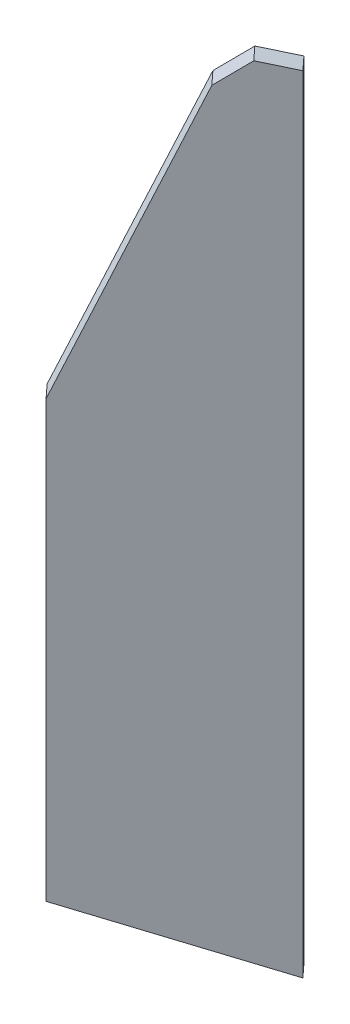
ISO-10303-21;
HEADER;
FILE_DESCRIPTION(('STEP AP214'),'2;1');
FILE_NAME('part.step','',(''),(''),'','','');
FILE_SCHEMA(('AUTOMOTIVE_DESIGN { 1 0 10303 214 1 1 1 1 }'));
ENDSEC;
DATA;
#1=APPLICATION_CONTEXT('core data for automotive mechanical design processes');
#2=APPLICATION_PROTOCOL_DEFINITION('international standard','automotive_design',2000,#1);
#3=PRODUCT_CONTEXT('',#1,'mechanical');
#4=PRODUCT('Part','Part','',(#3));
#5=PRODUCT_RELATED_PRODUCT_CATEGORY('part','',(#4));
#6=PRODUCT_DEFINITION_FORMATION('','',#4);
#7=PRODUCT_DEFINITION_CONTEXT('part definition',#1,'design');
#8=PRODUCT_DEFINITION('design','',#6,#7);
#9=PRODUCT_DEFINITION_SHAPE('','',#8);
#10=(LENGTH_UNIT() NAMED_UNIT(*) SI_UNIT(.MILLI.,.METRE.));
#11=(NAMED_UNIT(*) PLANE_ANGLE_UNIT() SI_UNIT($,.RADIAN.));
#12=(NAMED_UNIT(*) SI_UNIT($,.STERADIAN.) SOLID_ANGLE_UNIT());
#13=UNCERTAINTY_MEASURE_WITH_UNIT(LENGTH_MEASURE(1.E-05),#10,'distance_accuracy_value','');
#14=(GEOMETRIC_REPRESENTATION_CONTEXT(3) GLOBAL_UNCERTAINTY_ASSIGNED_CONTEXT((#13)) GLOBAL_UNIT_ASSIGNED_CONTEXT((#10,
#11,#12)) REPRESENTATION_CONTEXT('',''));
#15=CARTESIAN_POINT('',(0.,0.,0.));
#16=DIRECTION('',(0.,0.,1.));
#17=DIRECTION('',(1.,0.,0.));
#18=AXIS2_PLACEMENT_3D('',#15,#16,#17);
#19=CARTESIAN_POINT('',(-55.2397531441101,-29.7349964285659,79.9559151833079));
#20=DIRECTION('',(0.234387289214174,0.947866554452466,-0.21589718294883));
#21=DIRECTION('',(-0.970760878934942,0.240048569938376,0.));
#22=AXIS2_PLACEMENT_3D('',#19,#20,#21);
#23=PLANE('',#22);
#24=DIRECTION('',(-0.697177625643394,0.318667530430086,0.642179385648457));
#25=VECTOR('',#24,1.);
#26=CARTESIAN_POINT('',(-54.1557534901387,-29.7349964285659,81.1327519392728));
#27=LINE('',#26,#25);
#28=CARTESIAN_POINT('',(-54.1557534901387,-29.7349964285659,81.1327519392728));
#29=VERTEX_POINT('',#28);
#30=CARTESIAN_POINT('',(-65.9713513617563,-24.3342961538997,92.0162529341049));
#31=VERTEX_POINT('',#30);
#32=EDGE_CURVE('E131',#29,#31,#27,.T.);
#33=ORIENTED_EDGE('',*,*,#32,.T.);
#34=DIRECTION('',(0.67749978373212,0.,0.735522972478039));
#35=VECTOR('',#34,1.);
#36=CARTESIAN_POINT('',(-67.0553510157277,-24.3342961538997,90.8394161781401));
#37=LINE('',#36,#35);
#38=CARTESIAN_POINT('',(-67.0553510157277,-24.3342961538997,90.8394161781401));
#39=VERTEX_POINT('',#38);
#40=EDGE_CURVE('E11',#39,#31,#37,.T.);
#41=ORIENTED_EDGE('',*,*,#40,.F.);
#42=DIRECTION('',(-0.697177625643394,0.318667530430086,0.642179385648457));
#43=VECTOR('',#42,1.);
#44=CARTESIAN_POINT('',(-55.2397531441101,-29.7349964285659,79.9559151833079));
#45=LINE('',#44,#43);
#46=CARTESIAN_POINT('',(-55.2397531441101,-29.7349964285659,79.9559151833079));
#47=VERTEX_POINT('',#46);
#48=EDGE_CURVE('E143',#47,#39,#45,.T.);
#49=ORIENTED_EDGE('',*,*,#48,.F.);
#50=DIRECTION('',(0.67749978373212,0.,0.735522972478039));
#51=VECTOR('',#50,1.);
#52=CARTESIAN_POINT('',(-55.2397531441101,-29.7349964285659,79.9559151833079));
#53=LINE('',#52,#51);
#54=EDGE_CURVE('E127',#47,#29,#53,.T.);
#55=ORIENTED_EDGE('',*,*,#54,.T.);
#56=EDGE_LOOP('',(#33,#41,#49,#55));
#57=FACE_BOUND('',#56,.T.);
#58=ADVANCED_FACE('F35',(#57),#23,.F.);
#59=CARTESIAN_POINT('',(-67.0553510157277,-24.3342961538997,90.8394161781401));
#60=DIRECTION('',(0.735522972478039,0.,-0.67749978373212));
#61=DIRECTION('',(-0.67749978373212,0.,-0.735522972478039));
#62=AXIS2_PLACEMENT_3D('',#59,#60,#61);
#63=PLANE('',#62);
#64=DIRECTION('',(0.,1.,0.));
#65=VECTOR('',#64,1.);
#66=CARTESIAN_POINT('',(-65.9713513617563,-24.3342961538997,92.0162529341049));
#67=LINE('',#66,#65);
#68=CARTESIAN_POINT('',(-65.9713513617562,14.1491071070957,92.016252934105));
#69=VERTEX_POINT('',#68);
#70=EDGE_CURVE('E134',#31,#69,#67,.T.);
#71=ORIENTED_EDGE('',*,*,#70,.T.);
#72=DIRECTION('',(0.67749978373212,0.,0.735522972478039));
#73=VECTOR('',#72,1.);
#74=CARTESIAN_POINT('',(-67.0553510157276,14.1491071070957,90.8394161781401));
#75=LINE('',#74,#73);
#76=CARTESIAN_POINT('',(-67.0553510157276,14.1491071070957,90.8394161781401));
#77=VERTEX_POINT('',#76);
#78=EDGE_CURVE('E42',#77,#69,#75,.T.);
#79=ORIENTED_EDGE('',*,*,#78,.F.);
#80=DIRECTION('',(0.,1.,0.));
#81=VECTOR('',#80,1.);
#82=CARTESIAN_POINT('',(-67.0553510157277,-24.3342961538997,90.8394161781401));
#83=LINE('',#82,#81);
#84=EDGE_CURVE('E93',#39,#77,#83,.T.);
#85=ORIENTED_EDGE('',*,*,#84,.F.);
#86=ORIENTED_EDGE('',*,*,#40,.T.);
#87=EDGE_LOOP('',(#71,#79,#85,#86));
#88=FACE_BOUND('',#87,.T.);
#89=ADVANCED_FACE('F265',(#88),#63,.F.);
#90=CARTESIAN_POINT('',(-67.0553510157276,14.1491071070957,90.8394161781401));
#91=DIRECTION('',(0.676419640063581,-0.392751873488977,-0.623058934938866));
#92=DIRECTION('',(-0.677499783732121,0.,-0.735522972478039));
#93=AXIS2_PLACEMENT_3D('',#90,#91,#92);
#94=PLANE('',#93);
#95=DIRECTION('',(0.288878025434932,0.919644477975537,-0.266089309349165));
#96=VECTOR('',#95,1.);
#97=CARTESIAN_POINT('',(-65.9713513617562,14.1491071070957,92.016252934105));
#98=LINE('',#97,#96);
#99=CARTESIAN_POINT('',(-58.3443051681729,38.4298425650203,84.9908814093267));
#100=VERTEX_POINT('',#99);
#101=EDGE_CURVE('E137',#69,#100,#98,.T.);
#102=ORIENTED_EDGE('',*,*,#101,.T.);
#103=DIRECTION('',(0.67749978373212,0.,0.735522972478039));
#104=VECTOR('',#103,1.);
#105=CARTESIAN_POINT('',(-59.4283048221443,38.4298425650203,83.8140446533618));
#106=LINE('',#105,#104);
#107=CARTESIAN_POINT('',(-59.4283048221443,38.4298425650203,83.8140446533618));
#108=VERTEX_POINT('',#107);
#109=EDGE_CURVE('E122',#108,#100,#106,.T.);
#110=ORIENTED_EDGE('',*,*,#109,.F.);
#111=DIRECTION('',(0.288878025434932,0.919644477975537,-0.266089309349165));
#112=VECTOR('',#111,1.);
#113=CARTESIAN_POINT('',(-67.0553510157276,14.1491071070957,90.8394161781401));
#114=LINE('',#113,#112);
#115=EDGE_CURVE('E110',#77,#108,#114,.T.);
#116=ORIENTED_EDGE('',*,*,#115,.F.);
#117=ORIENTED_EDGE('',*,*,#78,.T.);
#118=EDGE_LOOP('',(#102,#110,#116,#117));
#119=FACE_BOUND('',#118,.T.);
#120=ADVANCED_FACE('F149',(#119),#94,.F.);
#121=CARTESIAN_POINT('',(-59.4283048221443,38.4298425650203,83.8140446533618));
#122=DIRECTION('',(0.439600645277677,-0.80174157104137,-0.404921876336121));
#123=DIRECTION('',(0.876841957119637,0.480778724814862,0.));
#124=AXIS2_PLACEMENT_3D('',#121,#122,#123);
#125=PLANE('',#124);
#126=DIRECTION('',(0.58969934349156,0.597670856964028,-0.543179740989581));
#127=VECTOR('',#126,1.);
#128=CARTESIAN_POINT('',(-58.3443051681729,38.4298425650203,84.9908814093267));
#129=LINE('',#128,#127);
#130=CARTESIAN_POINT('',(-56.4145741469206,40.3856595519498,83.2133810477066));
#131=VERTEX_POINT('',#130);
#132=EDGE_CURVE('E119',#100,#131,#129,.T.);
#133=ORIENTED_EDGE('',*,*,#132,.T.);
#134=DIRECTION('',(0.67749978373212,0.,0.735522972478039));
#135=VECTOR('',#134,1.);
#136=CARTESIAN_POINT('',(-57.498573800892,40.3856595519498,82.0365442917417));
#137=LINE('',#136,#135);
#138=CARTESIAN_POINT('',(-57.498573800892,40.3856595519498,82.0365442917417));
#139=VERTEX_POINT('',#138);
#140=EDGE_CURVE('E116',#139,#131,#137,.T.);
#141=ORIENTED_EDGE('',*,*,#140,.F.);
#142=DIRECTION('',(0.58969934349156,0.597670856964028,-0.543179740989581));
#143=VECTOR('',#142,1.);
#144=CARTESIAN_POINT('',(-59.4283048221443,38.4298425650203,83.8140446533618));
#145=LINE('',#144,#143);
#146=EDGE_CURVE('E103',#108,#139,#145,.T.);
#147=ORIENTED_EDGE('',*,*,#146,.F.);
#148=ORIENTED_EDGE('',*,*,#109,.T.);
#149=EDGE_LOOP('',(#133,#141,#147,#148));
#150=FACE_BOUND('',#149,.T.);
#151=ADVANCED_FACE('F117',(#150),#125,.F.);
#152=CARTESIAN_POINT('',(-57.498573800892,40.3856595519498,82.0365442917417));
#153=DIRECTION('',(-0.157461007350547,-0.976816056593372,0.145039383429211));
#154=DIRECTION('',(0.9872554111671,-0.159143812701845,0.));
#155=AXIS2_PLACEMENT_3D('',#152,#153,#154);
#156=PLANE('',#155);
#157=DIRECTION('',(0.718470649509834,-0.214080339081792,-0.661792667088071));
#158=VECTOR('',#157,1.);
#159=CARTESIAN_POINT('',(-56.4145741469206,40.3856595519498,83.2133810477066));
#160=LINE('',#159,#158);
#161=CARTESIAN_POINT('',(-54.1557534901386,39.7126061816294,81.1327519392729));
#162=VERTEX_POINT('',#161);
#163=EDGE_CURVE('E140',#131,#162,#160,.T.);
#164=ORIENTED_EDGE('',*,*,#163,.T.);
#165=DIRECTION('',(0.67749978373212,0.,0.735522972478039));
#166=VECTOR('',#165,1.);
#167=CARTESIAN_POINT('',(-55.23975314411,39.7126061816294,79.955915183308));
#168=LINE('',#167,#166);
#169=CARTESIAN_POINT('',(-55.23975314411,39.7126061816294,79.955915183308));
#170=VERTEX_POINT('',#169);
#171=EDGE_CURVE('E123',#170,#162,#168,.T.);
#172=ORIENTED_EDGE('',*,*,#171,.F.);
#173=DIRECTION('',(0.718470649509834,-0.214080339081792,-0.661792667088071));
#174=VECTOR('',#173,1.);
#175=CARTESIAN_POINT('',(-57.498573800892,40.3856595519498,82.0365442917417));
#176=LINE('',#175,#174);
#177=EDGE_CURVE('E107',#139,#170,#176,.T.);
#178=ORIENTED_EDGE('',*,*,#177,.F.);
#179=ORIENTED_EDGE('',*,*,#140,.T.);
#180=EDGE_LOOP('',(#164,#172,#178,#179));
#181=FACE_BOUND('',#180,.T.);
#182=ADVANCED_FACE('F125',(#181),#156,.F.);
#183=CARTESIAN_POINT('',(-55.23975314411,39.7126061816294,79.955915183308));
#184=DIRECTION('',(-0.735522972478039,0.,0.67749978373212));
#185=DIRECTION('',(0.67749978373212,0.,0.735522972478039));
#186=AXIS2_PLACEMENT_3D('',#183,#184,#185);
#187=PLANE('',#186);
#188=DIRECTION('',(0.,-1.,0.));
#189=VECTOR('',#188,1.);
#190=CARTESIAN_POINT('',(-54.1557534901386,39.7126061816294,81.1327519392729));
#191=LINE('',#190,#189);
#192=EDGE_CURVE('E85',#162,#29,#191,.T.);
#193=ORIENTED_EDGE('',*,*,#192,.T.);
#194=ORIENTED_EDGE('',*,*,#54,.F.);
#195=DIRECTION('',(0.,-1.,0.));
#196=VECTOR('',#195,1.);
#197=CARTESIAN_POINT('',(-55.23975314411,39.7126061816294,79.955915183308));
#198=LINE('',#197,#196);
#199=EDGE_CURVE('E58',#170,#47,#198,.T.);
#200=ORIENTED_EDGE('',*,*,#199,.F.);
#201=ORIENTED_EDGE('',*,*,#171,.T.);
#202=EDGE_LOOP('',(#193,#194,#200,#201));
#203=FACE_BOUND('',#202,.T.);
#204=ADVANCED_FACE('F153',(#203),#187,.F.);
#205=CARTESIAN_POINT('',(14.4879884303449,0.,15.7287848223552));
#206=DIRECTION('',(-0.677499783732121,0.,-0.735522972478039));
#207=DIRECTION('',(-0.735522972478039,0.,0.677499783732121));
#208=AXIS2_PLACEMENT_3D('',#205,#206,#207);
#209=PLANE('',#208);
#210=DIRECTION('',(0.,-1.,0.));
#211=VECTOR('',#210,1.);
#212=CARTESIAN_POINT('',(-65.8785142597628,-23.1842060423844,89.7554165241686));
#213=LINE('',#212,#211);
#214=CARTESIAN_POINT('',(-65.8785142597628,14.1491071070957,89.7554165241688));
#215=VERTEX_POINT('',#214);
#216=CARTESIAN_POINT('',(-65.8785142597628,-23.1842060423844,89.7554165241686));
#217=VERTEX_POINT('',#216);
#218=EDGE_CURVE('E49',#215,#217,#213,.T.);
#219=ORIENTED_EDGE('',*,*,#218,.F.);
#220=DIRECTION('',(0.735522972478031,0.,-0.677499783732129));
#221=VECTOR('',#220,1.);
#222=CARTESIAN_POINT('',(-65.8785142597628,14.1491071070957,89.7554165241688));
#223=LINE('',#222,#221);
#224=CARTESIAN_POINT('',(-66.6140372322408,14.1491071070957,90.4329163079008));
#225=VERTEX_POINT('',#224);
#226=EDGE_CURVE('E176',#225,#215,#223,.T.);
#227=ORIENTED_EDGE('',*,*,#226,.F.);
#228=DIRECTION('',(0.,1.,0.));
#229=VECTOR('',#228,1.);
#230=CARTESIAN_POINT('',(-66.6140372322408,-23.9030123620815,90.4329163079007));
#231=LINE('',#230,#229);
#232=CARTESIAN_POINT('',(-66.6140372322408,-23.9030123620815,90.4329163079007));
#233=VERTEX_POINT('',#232);
#234=EDGE_CURVE('E180',#233,#225,#231,.T.);
#235=ORIENTED_EDGE('',*,*,#234,.F.);
#236=DIRECTION('',(-0.697177625643394,0.318667530430086,0.642179385648457));
#237=VECTOR('',#236,1.);
#238=CARTESIAN_POINT('',(-56.5766518656563,-28.4909232317006,81.1873499971897));
#239=LINE('',#238,#237);
#240=CARTESIAN_POINT('',(-56.5766518656563,-28.4909232317006,81.1873499971897));
#241=VERTEX_POINT('',#240);
#242=EDGE_CURVE('E183',#241,#233,#239,.T.);
#243=ORIENTED_EDGE('',*,*,#242,.F.);
#244=DIRECTION('',(0.,-1.,0.));
#245=VECTOR('',#244,1.);
#246=CARTESIAN_POINT('',(-56.5766518656563,-27.4359224034694,81.1873499971897));
#247=LINE('',#246,#245);
#248=CARTESIAN_POINT('',(-56.5766518656563,-27.4359224034694,81.1873499971897));
#249=VERTEX_POINT('',#248);
#250=EDGE_CURVE('E186',#249,#241,#247,.T.);
#251=ORIENTED_EDGE('',*,*,#250,.F.);
#252=DIRECTION('',(0.697177625643394,-0.318667530430085,-0.642179385648458));
#253=VECTOR('',#252,1.);
#254=CARTESIAN_POINT('',(-56.5766518656563,-27.4359224034694,81.1873499971897));
#255=LINE('',#254,#253);
#256=EDGE_CURVE('E189',#217,#249,#255,.T.);
#257=ORIENTED_EDGE('',*,*,#256,.F.);
#258=EDGE_LOOP('',(#219,#227,#235,#243,#251,#257));
#259=FACE_BOUND('',#258,.T.);
#260=ORIENTED_EDGE('',*,*,#48,.T.);
#261=ORIENTED_EDGE('',*,*,#84,.T.);
#262=ORIENTED_EDGE('',*,*,#115,.T.);
#263=ORIENTED_EDGE('',*,*,#146,.T.);
#264=ORIENTED_EDGE('',*,*,#177,.T.);
#265=ORIENTED_EDGE('',*,*,#199,.T.);
#266=EDGE_LOOP('',(#260,#261,#262,#263,#264,#265));
#267=FACE_BOUND('',#266,.T.);
#268=ADVANCED_FACE('F105',(#259,#267),#209,.T.);
#269=CARTESIAN_POINT('',(15.5719880843163,0.,16.9056215783201));
#270=DIRECTION('',(-0.677499783732121,0.,-0.735522972478039));
#271=DIRECTION('',(-0.735522972478039,0.,0.677499783732121));
#272=AXIS2_PLACEMENT_3D('',#269,#270,#271);
#273=PLANE('',#272);
#274=ORIENTED_EDGE('',*,*,#32,.F.);
#275=ORIENTED_EDGE('',*,*,#192,.F.);
#276=ORIENTED_EDGE('',*,*,#163,.F.);
#277=ORIENTED_EDGE('',*,*,#132,.F.);
#278=ORIENTED_EDGE('',*,*,#101,.F.);
#279=ORIENTED_EDGE('',*,*,#70,.F.);
#280=EDGE_LOOP('',(#274,#275,#276,#277,#278,#279));
#281=FACE_BOUND('',#280,.T.);
#282=ADVANCED_FACE('F152',(#281),#273,.F.);
#283=CARTESIAN_POINT('',(-65.4720143895236,-23.1842060423844,90.1967303076555));
#284=DIRECTION('',(0.735522972478039,0.,-0.677499783732121));
#285=DIRECTION('',(-0.677499783732121,0.,-0.735522972478039));
#286=AXIS2_PLACEMENT_3D('',#283,#284,#285);
#287=PLANE('',#286);
#288=ORIENTED_EDGE('',*,*,#218,.T.);
#289=DIRECTION('',(-0.677499783732121,0.,-0.735522972478039));
#290=VECTOR('',#289,1.);
#291=CARTESIAN_POINT('',(-65.4720143895236,-23.1842060423844,90.1967303076555));
#292=LINE('',#291,#290);
#293=CARTESIAN_POINT('',(-65.4720143895236,-23.1842060423844,90.1967303076555));
#294=VERTEX_POINT('',#293);
#295=EDGE_CURVE('E160',#294,#217,#292,.T.);
#296=ORIENTED_EDGE('',*,*,#295,.F.);
#297=DIRECTION('',(0.,-1.,0.));
#298=VECTOR('',#297,1.);
#299=CARTESIAN_POINT('',(-65.4720143895236,-23.1842060423844,90.1967303076555));
#300=LINE('',#299,#298);
#301=CARTESIAN_POINT('',(-65.4720143895236,14.1491071070957,90.1967303076556));
#302=VERTEX_POINT('',#301);
#303=EDGE_CURVE('E179',#302,#294,#300,.T.);
#304=ORIENTED_EDGE('',*,*,#303,.F.);
#305=DIRECTION('',(-0.677499783732121,0.,-0.735522972478039));
#306=VECTOR('',#305,1.);
#307=CARTESIAN_POINT('',(-65.4720143895236,14.1491071070957,90.1967303076556));
#308=LINE('',#307,#306);
#309=EDGE_CURVE('E135',#302,#215,#308,.T.);
#310=ORIENTED_EDGE('',*,*,#309,.T.);
#311=EDGE_LOOP('',(#288,#296,#304,#310));
#312=FACE_BOUND('',#311,.T.);
#313=ADVANCED_FACE('F216',(#312),#287,.F.);
#314=CARTESIAN_POINT('',(-65.4720143895236,14.1491071070957,90.1967303076556));
#315=DIRECTION('',(0.,1.,0.));
#316=DIRECTION('',(0.,0.,1.));
#317=AXIS2_PLACEMENT_3D('',#314,#315,#316);
#318=PLANE('',#317);
#319=ORIENTED_EDGE('',*,*,#226,.T.);
#320=ORIENTED_EDGE('',*,*,#309,.F.);
#321=DIRECTION('',(0.735522972478031,0.,-0.677499783732129));
#322=VECTOR('',#321,1.);
#323=CARTESIAN_POINT('',(-65.4720143895236,14.1491071070957,90.1967303076556));
#324=LINE('',#323,#322);
#325=CARTESIAN_POINT('',(-66.2075373620015,14.1491071070957,90.8742300913877));
#326=VERTEX_POINT('',#325);
#327=EDGE_CURVE('E163',#326,#302,#324,.T.);
#328=ORIENTED_EDGE('',*,*,#327,.F.);
#329=DIRECTION('',(-0.677499783732121,0.,-0.735522972478039));
#330=VECTOR('',#329,1.);
#331=CARTESIAN_POINT('',(-66.2075373620015,14.1491071070957,90.8742300913877));
#332=LINE('',#331,#330);
#333=EDGE_CURVE('E172',#326,#225,#332,.T.);
#334=ORIENTED_EDGE('',*,*,#333,.T.);
#335=EDGE_LOOP('',(#319,#320,#328,#334));
#336=FACE_BOUND('',#335,.T.);
#337=ADVANCED_FACE('F232',(#336),#318,.F.);
#338=CARTESIAN_POINT('',(-66.2075373620016,-23.9030123620815,90.8742300913876));
#339=DIRECTION('',(-0.735522972478039,0.,0.677499783732121));
#340=DIRECTION('',(0.677499783732121,0.,0.735522972478039));
#341=AXIS2_PLACEMENT_3D('',#338,#339,#340);
#342=PLANE('',#341);
#343=ORIENTED_EDGE('',*,*,#234,.T.);
#344=ORIENTED_EDGE('',*,*,#333,.F.);
#345=DIRECTION('',(0.,1.,0.));
#346=VECTOR('',#345,1.);
#347=CARTESIAN_POINT('',(-66.2075373620016,-23.9030123620815,90.8742300913876));
#348=LINE('',#347,#346);
#349=CARTESIAN_POINT('',(-66.2075373620016,-23.9030123620815,90.8742300913876));
#350=VERTEX_POINT('',#349);
#351=EDGE_CURVE('E195',#350,#326,#348,.T.);
#352=ORIENTED_EDGE('',*,*,#351,.F.);
#353=DIRECTION('',(-0.677499783732121,0.,-0.735522972478039));
#354=VECTOR('',#353,1.);
#355=CARTESIAN_POINT('',(-66.2075373620016,-23.9030123620815,90.8742300913876));
#356=LINE('',#355,#354);
#357=EDGE_CURVE('E169',#350,#233,#356,.T.);
#358=ORIENTED_EDGE('',*,*,#357,.T.);
#359=EDGE_LOOP('',(#343,#344,#352,#358));
#360=FACE_BOUND('',#359,.T.);
#361=ADVANCED_FACE('F237',(#360),#342,.F.);
#362=CARTESIAN_POINT('',(-56.170151995417,-28.4909232317006,81.6286637806765));
#363=DIRECTION('',(-0.234387289214174,-0.947866554452466,0.21589718294883));
#364=DIRECTION('',(0.970760878934942,-0.240048569938376,0.));
#365=AXIS2_PLACEMENT_3D('',#362,#363,#364);
#366=PLANE('',#365);
#367=ORIENTED_EDGE('',*,*,#242,.T.);
#368=ORIENTED_EDGE('',*,*,#357,.F.);
#369=DIRECTION('',(-0.697177625643394,0.318667530430086,0.642179385648457));
#370=VECTOR('',#369,1.);
#371=CARTESIAN_POINT('',(-56.170151995417,-28.4909232317006,81.6286637806765));
#372=LINE('',#371,#370);
#373=CARTESIAN_POINT('',(-56.170151995417,-28.4909232317006,81.6286637806765));
#374=VERTEX_POINT('',#373);
#375=EDGE_CURVE('E198',#374,#350,#372,.T.);
#376=ORIENTED_EDGE('',*,*,#375,.F.);
#377=DIRECTION('',(-0.677499783732121,0.,-0.735522972478039));
#378=VECTOR('',#377,1.);
#379=CARTESIAN_POINT('',(-56.170151995417,-28.4909232317006,81.6286637806765));
#380=LINE('',#379,#378);
#381=EDGE_CURVE('E166',#374,#241,#380,.T.);
#382=ORIENTED_EDGE('',*,*,#381,.T.);
#383=EDGE_LOOP('',(#367,#368,#376,#382));
#384=FACE_BOUND('',#383,.T.);
#385=ADVANCED_FACE('F255',(#384),#366,.F.);
#386=CARTESIAN_POINT('',(-56.170151995417,-27.4359224034694,81.6286637806765));
#387=DIRECTION('',(0.735522972478039,0.,-0.677499783732121));
#388=DIRECTION('',(-0.677499783732121,0.,-0.735522972478039));
#389=AXIS2_PLACEMENT_3D('',#386,#387,#388);
#390=PLANE('',#389);
#391=ORIENTED_EDGE('',*,*,#250,.T.);
#392=ORIENTED_EDGE('',*,*,#381,.F.);
#393=DIRECTION('',(0.,-1.,0.));
#394=VECTOR('',#393,1.);
#395=CARTESIAN_POINT('',(-56.170151995417,-27.4359224034694,81.6286637806765));
#396=LINE('',#395,#394);
#397=CARTESIAN_POINT('',(-56.170151995417,-27.4359224034694,81.6286637806765));
#398=VERTEX_POINT('',#397);
#399=EDGE_CURVE('E201',#398,#374,#396,.T.);
#400=ORIENTED_EDGE('',*,*,#399,.F.);
#401=DIRECTION('',(-0.677499783732121,0.,-0.735522972478039));
#402=VECTOR('',#401,1.);
#403=CARTESIAN_POINT('',(-56.170151995417,-27.4359224034694,81.6286637806765));
#404=LINE('',#403,#402);
#405=EDGE_CURVE('E162',#398,#249,#404,.T.);
#406=ORIENTED_EDGE('',*,*,#405,.T.);
#407=EDGE_LOOP('',(#391,#392,#400,#406));
#408=FACE_BOUND('',#407,.T.);
#409=ADVANCED_FACE('F251',(#408),#390,.F.);
#410=CARTESIAN_POINT('',(-56.170151995417,-27.4359224034694,81.6286637806765));
#411=DIRECTION('',(0.234387289214174,0.947866554452466,-0.21589718294883));
#412=DIRECTION('',(-0.970760878934942,0.240048569938376,0.));
#413=AXIS2_PLACEMENT_3D('',#410,#411,#412);
#414=PLANE('',#413);
#415=ORIENTED_EDGE('',*,*,#256,.T.);
#416=ORIENTED_EDGE('',*,*,#405,.F.);
#417=DIRECTION('',(0.697177625643394,-0.318667530430085,-0.642179385648458));
#418=VECTOR('',#417,1.);
#419=CARTESIAN_POINT('',(-56.170151995417,-27.4359224034694,81.6286637806765));
#420=LINE('',#419,#418);
#421=EDGE_CURVE('E204',#294,#398,#420,.T.);
#422=ORIENTED_EDGE('',*,*,#421,.F.);
#423=ORIENTED_EDGE('',*,*,#295,.T.);
#424=EDGE_LOOP('',(#415,#416,#422,#423));
#425=FACE_BOUND('',#424,.T.);
#426=ADVANCED_FACE('F245',(#425),#414,.F.);
#427=CARTESIAN_POINT('',(14.8944883005835,0.,16.170098605841));
#428=DIRECTION('',(0.677499783732129,0.,0.735522972478031));
#429=DIRECTION('',(0.735522972478031,0.,-0.677499783732129));
#430=AXIS2_PLACEMENT_3D('',#427,#428,#429);
#431=PLANE('',#430);
#432=ORIENTED_EDGE('',*,*,#303,.T.);
#433=ORIENTED_EDGE('',*,*,#421,.T.);
#434=ORIENTED_EDGE('',*,*,#399,.T.);
#435=ORIENTED_EDGE('',*,*,#375,.T.);
#436=ORIENTED_EDGE('',*,*,#351,.T.);
#437=ORIENTED_EDGE('',*,*,#327,.T.);
#438=EDGE_LOOP('',(#432,#433,#434,#435,#436,#437));
#439=FACE_BOUND('',#438,.T.);
#440=ADVANCED_FACE('F211',(#439),#431,.F.);
#441=CLOSED_SHELL('',(#58,#89,#120,#151,#182,#204,#268,#282,#313,#337,#361,#385,#409,#426,#440));
#442=MANIFOLD_SOLID_BREP('B2',#441);
#443=ADVANCED_BREP_SHAPE_REPRESENTATION('',(#18,#442),#14);
#444=SHAPE_DEFINITION_REPRESENTATION(#9,#443);
ENDSEC;
END-ISO-10303-21;
